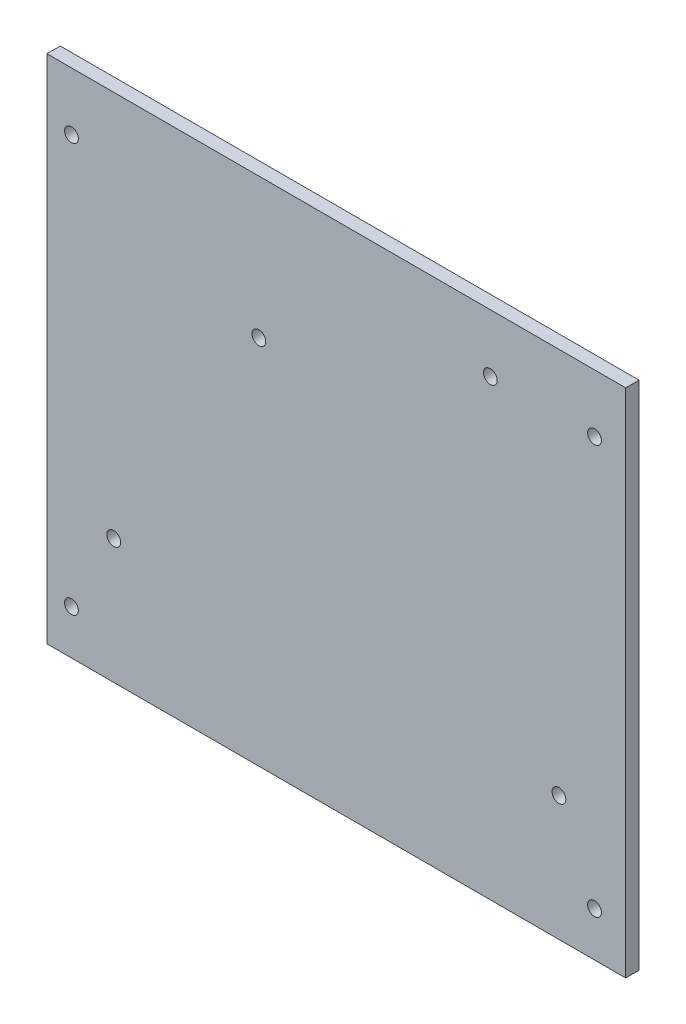
ISO-10303-21;
HEADER;
FILE_DESCRIPTION(('STEP AP214'),'2;1');
FILE_NAME('part.step','',(''),(''),'','','');
FILE_SCHEMA(('AUTOMOTIVE_DESIGN { 1 0 10303 214 1 1 1 1 }'));
ENDSEC;
DATA;
#1=APPLICATION_CONTEXT('core data for automotive mechanical design processes');
#2=APPLICATION_PROTOCOL_DEFINITION('international standard','automotive_design',2000,#1);
#3=PRODUCT_CONTEXT('',#1,'mechanical');
#4=PRODUCT('Part','Part','',(#3));
#5=PRODUCT_RELATED_PRODUCT_CATEGORY('part','',(#4));
#6=PRODUCT_DEFINITION_FORMATION('','',#4);
#7=PRODUCT_DEFINITION_CONTEXT('part definition',#1,'design');
#8=PRODUCT_DEFINITION('design','',#6,#7);
#9=PRODUCT_DEFINITION_SHAPE('','',#8);
#10=(LENGTH_UNIT() NAMED_UNIT(*) SI_UNIT(.MILLI.,.METRE.));
#11=(NAMED_UNIT(*) PLANE_ANGLE_UNIT() SI_UNIT($,.RADIAN.));
#12=(NAMED_UNIT(*) SI_UNIT($,.STERADIAN.) SOLID_ANGLE_UNIT());
#13=UNCERTAINTY_MEASURE_WITH_UNIT(LENGTH_MEASURE(1.E-05),#10,'distance_accuracy_value','');
#14=(GEOMETRIC_REPRESENTATION_CONTEXT(3) GLOBAL_UNCERTAINTY_ASSIGNED_CONTEXT((#13)) GLOBAL_UNIT_ASSIGNED_CONTEXT((#10,
#11,#12)) REPRESENTATION_CONTEXT('',''));
#15=CARTESIAN_POINT('',(0.,0.,0.));
#16=DIRECTION('',(0.,0.,1.));
#17=DIRECTION('',(1.,0.,0.));
#18=AXIS2_PLACEMENT_3D('',#15,#16,#17);
#19=CARTESIAN_POINT('',(0.,0.,3.));
#20=DIRECTION('',(0.,0.,-1.));
#21=DIRECTION('',(-1.,0.,0.));
#22=AXIS2_PLACEMENT_3D('',#19,#20,#21);
#23=PLANE('',#22);
#24=CARTESIAN_POINT('',(34.6,44.4,3.));
#25=DIRECTION('',(0.,0.,-1.));
#26=DIRECTION('',(-1.,0.,0.));
#27=AXIS2_PLACEMENT_3D('',#24,#25,#26);
#28=CIRCLE('',#27,1.55);
#29=CARTESIAN_POINT('',(33.05,44.4,3.));
#30=VERTEX_POINT('',#29);
#31=EDGE_CURVE('E143',#30,#30,#28,.F.);
#32=ORIENTED_EDGE('',*,*,#31,.F.);
#33=EDGE_LOOP('',(#32));
#34=FACE_BOUND('',#33,.T.);
#35=CARTESIAN_POINT('',(-17.4,25.96,3.));
#36=DIRECTION('',(0.,0.,-1.));
#37=DIRECTION('',(-1.,0.,0.));
#38=AXIS2_PLACEMENT_3D('',#35,#36,#37);
#39=CIRCLE('',#38,1.55);
#40=CARTESIAN_POINT('',(-18.95,25.96,3.));
#41=VERTEX_POINT('',#40);
#42=EDGE_CURVE('E148',#41,#41,#39,.F.);
#43=ORIENTED_EDGE('',*,*,#42,.F.);
#44=EDGE_LOOP('',(#43));
#45=FACE_BOUND('',#44,.T.);
#46=CARTESIAN_POINT('',(50.,-29.4,3.));
#47=DIRECTION('',(0.,0.,-1.));
#48=DIRECTION('',(-1.,0.,0.));
#49=AXIS2_PLACEMENT_3D('',#46,#47,#48);
#50=CIRCLE('',#49,1.54999999999999);
#51=CARTESIAN_POINT('',(48.45,-29.4,3.));
#52=VERTEX_POINT('',#51);
#53=EDGE_CURVE('E133',#52,#52,#50,.F.);
#54=ORIENTED_EDGE('',*,*,#53,.F.);
#55=EDGE_LOOP('',(#54));
#56=FACE_BOUND('',#55,.T.);
#57=CARTESIAN_POINT('',(-50.,-29.4,3.));
#58=DIRECTION('',(0.,0.,-1.));
#59=DIRECTION('',(-1.,0.,0.));
#60=AXIS2_PLACEMENT_3D('',#57,#58,#59);
#61=CIRCLE('',#60,1.54999999999999);
#62=CARTESIAN_POINT('',(-51.55,-29.4,3.));
#63=VERTEX_POINT('',#62);
#64=EDGE_CURVE('E136',#63,#63,#61,.F.);
#65=ORIENTED_EDGE('',*,*,#64,.F.);
#66=EDGE_LOOP('',(#65));
#67=FACE_BOUND('',#66,.T.);
#68=DIRECTION('',(0.,1.,0.));
#69=VECTOR('',#68,1.);
#70=CARTESIAN_POINT('',(65.,-57.4,3.));
#71=LINE('',#70,#69);
#72=CARTESIAN_POINT('',(65.,-57.4,3.));
#73=VERTEX_POINT('',#72);
#74=CARTESIAN_POINT('',(65.,57.4,3.));
#75=VERTEX_POINT('',#74);
#76=EDGE_CURVE('E85',#73,#75,#71,.T.);
#77=ORIENTED_EDGE('',*,*,#76,.T.);
#78=DIRECTION('',(-1.,0.,0.));
#79=VECTOR('',#78,1.);
#80=CARTESIAN_POINT('',(-65.,57.4,3.));
#81=LINE('',#80,#79);
#82=CARTESIAN_POINT('',(-65.,57.4,3.));
#83=VERTEX_POINT('',#82);
#84=EDGE_CURVE('E80',#75,#83,#81,.T.);
#85=ORIENTED_EDGE('',*,*,#84,.T.);
#86=DIRECTION('',(0.,-1.,0.));
#87=VECTOR('',#86,1.);
#88=CARTESIAN_POINT('',(-65.,-57.4,3.));
#89=LINE('',#88,#87);
#90=CARTESIAN_POINT('',(-65.,-57.4,3.));
#91=VERTEX_POINT('',#90);
#92=EDGE_CURVE('E83',#83,#91,#89,.T.);
#93=ORIENTED_EDGE('',*,*,#92,.T.);
#94=DIRECTION('',(1.,0.,0.));
#95=VECTOR('',#94,1.);
#96=CARTESIAN_POINT('',(-65.,-57.4,3.));
#97=LINE('',#96,#95);
#98=EDGE_CURVE('E50',#91,#73,#97,.T.);
#99=ORIENTED_EDGE('',*,*,#98,.T.);
#100=EDGE_LOOP('',(#77,#85,#93,#99));
#101=FACE_BOUND('',#100,.T.);
#102=CARTESIAN_POINT('',(-59.5,44.4,3.));
#103=DIRECTION('',(0.,0.,1.));
#104=DIRECTION('',(1.,0.,0.));
#105=AXIS2_PLACEMENT_3D('',#102,#103,#104);
#106=CIRCLE('',#105,1.55);
#107=CARTESIAN_POINT('',(-57.95,44.4,3.));
#108=VERTEX_POINT('',#107);
#109=EDGE_CURVE('E100',#108,#108,#106,.T.);
#110=ORIENTED_EDGE('',*,*,#109,.F.);
#111=EDGE_LOOP('',(#110));
#112=FACE_BOUND('',#111,.T.);
#113=CARTESIAN_POINT('',(58.,44.4,3.));
#114=DIRECTION('',(0.,0.,1.));
#115=DIRECTION('',(1.,0.,0.));
#116=AXIS2_PLACEMENT_3D('',#113,#114,#115);
#117=CIRCLE('',#116,1.55);
#118=CARTESIAN_POINT('',(59.55,44.4,3.));
#119=VERTEX_POINT('',#118);
#120=EDGE_CURVE('E115',#119,#119,#117,.T.);
#121=ORIENTED_EDGE('',*,*,#120,.F.);
#122=EDGE_LOOP('',(#121));
#123=FACE_BOUND('',#122,.T.);
#124=CARTESIAN_POINT('',(58.,-47.4,3.));
#125=DIRECTION('',(0.,0.,1.));
#126=DIRECTION('',(1.,0.,0.));
#127=AXIS2_PLACEMENT_3D('',#124,#125,#126);
#128=CIRCLE('',#127,1.55);
#129=CARTESIAN_POINT('',(59.55,-47.4,3.));
#130=VERTEX_POINT('',#129);
#131=EDGE_CURVE('E121',#130,#130,#128,.T.);
#132=ORIENTED_EDGE('',*,*,#131,.F.);
#133=EDGE_LOOP('',(#132));
#134=FACE_BOUND('',#133,.T.);
#135=CARTESIAN_POINT('',(-59.5,-47.4,3.));
#136=DIRECTION('',(0.,0.,1.));
#137=DIRECTION('',(1.,0.,0.));
#138=AXIS2_PLACEMENT_3D('',#135,#136,#137);
#139=CIRCLE('',#138,1.55);
#140=CARTESIAN_POINT('',(-57.95,-47.4,3.));
#141=VERTEX_POINT('',#140);
#142=EDGE_CURVE('E127',#141,#141,#139,.T.);
#143=ORIENTED_EDGE('',*,*,#142,.F.);
#144=EDGE_LOOP('',(#143));
#145=FACE_BOUND('',#144,.T.);
#146=ADVANCED_FACE('F33',(#34,#45,#56,#67,#101,#112,#123,#134,#145),#23,.F.);
#147=CARTESIAN_POINT('',(0.,0.,0.));
#148=DIRECTION('',(0.,0.,-1.));
#149=DIRECTION('',(-1.,0.,0.));
#150=AXIS2_PLACEMENT_3D('',#147,#148,#149);
#151=PLANE('',#150);
#152=CARTESIAN_POINT('',(34.6,44.4,0.));
#153=DIRECTION('',(0.,0.,-1.));
#154=DIRECTION('',(-1.,0.,0.));
#155=AXIS2_PLACEMENT_3D('',#152,#153,#154);
#156=CIRCLE('',#155,1.55);
#157=CARTESIAN_POINT('',(33.05,44.4,0.));
#158=VERTEX_POINT('',#157);
#159=EDGE_CURVE('E151',#158,#158,#156,.T.);
#160=ORIENTED_EDGE('',*,*,#159,.F.);
#161=EDGE_LOOP('',(#160));
#162=FACE_BOUND('',#161,.T.);
#163=CARTESIAN_POINT('',(-17.4,25.96,0.));
#164=DIRECTION('',(0.,0.,-1.));
#165=DIRECTION('',(-1.,0.,0.));
#166=AXIS2_PLACEMENT_3D('',#163,#164,#165);
#167=CIRCLE('',#166,1.55);
#168=CARTESIAN_POINT('',(-18.95,25.96,0.));
#169=VERTEX_POINT('',#168);
#170=EDGE_CURVE('E152',#169,#169,#167,.T.);
#171=ORIENTED_EDGE('',*,*,#170,.F.);
#172=EDGE_LOOP('',(#171));
#173=FACE_BOUND('',#172,.T.);
#174=CARTESIAN_POINT('',(50.,-29.4,0.));
#175=DIRECTION('',(0.,0.,-1.));
#176=DIRECTION('',(-1.,0.,0.));
#177=AXIS2_PLACEMENT_3D('',#174,#175,#176);
#178=CIRCLE('',#177,1.54999999999999);
#179=CARTESIAN_POINT('',(48.45,-29.4,0.));
#180=VERTEX_POINT('',#179);
#181=EDGE_CURVE('E139',#180,#180,#178,.T.);
#182=ORIENTED_EDGE('',*,*,#181,.F.);
#183=EDGE_LOOP('',(#182));
#184=FACE_BOUND('',#183,.T.);
#185=CARTESIAN_POINT('',(-50.,-29.4,0.));
#186=DIRECTION('',(0.,0.,-1.));
#187=DIRECTION('',(-1.,0.,0.));
#188=AXIS2_PLACEMENT_3D('',#185,#186,#187);
#189=CIRCLE('',#188,1.54999999999999);
#190=CARTESIAN_POINT('',(-51.55,-29.4,0.));
#191=VERTEX_POINT('',#190);
#192=EDGE_CURVE('E140',#191,#191,#189,.T.);
#193=ORIENTED_EDGE('',*,*,#192,.F.);
#194=EDGE_LOOP('',(#193));
#195=FACE_BOUND('',#194,.T.);
#196=CARTESIAN_POINT('',(58.,-47.4,0.));
#197=DIRECTION('',(0.,0.,1.));
#198=DIRECTION('',(1.,0.,0.));
#199=AXIS2_PLACEMENT_3D('',#196,#197,#198);
#200=CIRCLE('',#199,1.55);
#201=CARTESIAN_POINT('',(59.55,-47.4,0.));
#202=VERTEX_POINT('',#201);
#203=EDGE_CURVE('E124',#202,#202,#200,.T.);
#204=ORIENTED_EDGE('',*,*,#203,.T.);
#205=EDGE_LOOP('',(#204));
#206=FACE_BOUND('',#205,.T.);
#207=CARTESIAN_POINT('',(-59.5,44.4,0.));
#208=DIRECTION('',(0.,0.,1.));
#209=DIRECTION('',(1.,0.,0.));
#210=AXIS2_PLACEMENT_3D('',#207,#208,#209);
#211=CIRCLE('',#210,1.55);
#212=CARTESIAN_POINT('',(-57.95,44.4,0.));
#213=VERTEX_POINT('',#212);
#214=EDGE_CURVE('E112',#213,#213,#211,.T.);
#215=ORIENTED_EDGE('',*,*,#214,.T.);
#216=EDGE_LOOP('',(#215));
#217=FACE_BOUND('',#216,.T.);
#218=DIRECTION('',(0.,1.,0.));
#219=VECTOR('',#218,1.);
#220=CARTESIAN_POINT('',(65.,-57.4,0.));
#221=LINE('',#220,#219);
#222=CARTESIAN_POINT('',(65.,-57.4,0.));
#223=VERTEX_POINT('',#222);
#224=CARTESIAN_POINT('',(65.,57.4,0.));
#225=VERTEX_POINT('',#224);
#226=EDGE_CURVE('E97',#223,#225,#221,.T.);
#227=ORIENTED_EDGE('',*,*,#226,.F.);
#228=DIRECTION('',(1.,0.,0.));
#229=VECTOR('',#228,1.);
#230=CARTESIAN_POINT('',(-65.,-57.4,0.));
#231=LINE('',#230,#229);
#232=CARTESIAN_POINT('',(-65.,-57.4,0.));
#233=VERTEX_POINT('',#232);
#234=EDGE_CURVE('E73',#233,#223,#231,.T.);
#235=ORIENTED_EDGE('',*,*,#234,.F.);
#236=DIRECTION('',(0.,-1.,0.));
#237=VECTOR('',#236,1.);
#238=CARTESIAN_POINT('',(-65.,-57.4,0.));
#239=LINE('',#238,#237);
#240=CARTESIAN_POINT('',(-65.,57.4,0.));
#241=VERTEX_POINT('',#240);
#242=EDGE_CURVE('E67',#241,#233,#239,.T.);
#243=ORIENTED_EDGE('',*,*,#242,.F.);
#244=DIRECTION('',(-1.,0.,0.));
#245=VECTOR('',#244,1.);
#246=CARTESIAN_POINT('',(-65.,57.4,0.));
#247=LINE('',#246,#245);
#248=EDGE_CURVE('E89',#225,#241,#247,.T.);
#249=ORIENTED_EDGE('',*,*,#248,.F.);
#250=EDGE_LOOP('',(#227,#235,#243,#249));
#251=FACE_BOUND('',#250,.T.);
#252=CARTESIAN_POINT('',(58.,44.4,0.));
#253=DIRECTION('',(0.,0.,1.));
#254=DIRECTION('',(1.,0.,0.));
#255=AXIS2_PLACEMENT_3D('',#252,#253,#254);
#256=CIRCLE('',#255,1.55);
#257=CARTESIAN_POINT('',(59.55,44.4,0.));
#258=VERTEX_POINT('',#257);
#259=EDGE_CURVE('E118',#258,#258,#256,.T.);
#260=ORIENTED_EDGE('',*,*,#259,.T.);
#261=EDGE_LOOP('',(#260));
#262=FACE_BOUND('',#261,.T.);
#263=CARTESIAN_POINT('',(-59.5,-47.4,0.));
#264=DIRECTION('',(0.,0.,1.));
#265=DIRECTION('',(1.,0.,0.));
#266=AXIS2_PLACEMENT_3D('',#263,#264,#265);
#267=CIRCLE('',#266,1.55);
#268=CARTESIAN_POINT('',(-57.95,-47.4,0.));
#269=VERTEX_POINT('',#268);
#270=EDGE_CURVE('E130',#269,#269,#267,.T.);
#271=ORIENTED_EDGE('',*,*,#270,.T.);
#272=EDGE_LOOP('',(#271));
#273=FACE_BOUND('',#272,.T.);
#274=ADVANCED_FACE('F108',(#162,#173,#184,#195,#206,#217,#251,#262,#273),#151,.T.);
#275=CARTESIAN_POINT('',(65.,-57.4,3.));
#276=DIRECTION('',(-1.,0.,0.));
#277=DIRECTION('',(0.,0.,1.));
#278=AXIS2_PLACEMENT_3D('',#275,#276,#277);
#279=PLANE('',#278);
#280=ORIENTED_EDGE('',*,*,#226,.T.);
#281=DIRECTION('',(0.,0.,-1.));
#282=VECTOR('',#281,1.);
#283=CARTESIAN_POINT('',(65.,57.4,3.));
#284=LINE('',#283,#282);
#285=EDGE_CURVE('E11',#75,#225,#284,.T.);
#286=ORIENTED_EDGE('',*,*,#285,.F.);
#287=ORIENTED_EDGE('',*,*,#76,.F.);
#288=DIRECTION('',(0.,0.,-1.));
#289=VECTOR('',#288,1.);
#290=CARTESIAN_POINT('',(65.,-57.4,3.));
#291=LINE('',#290,#289);
#292=EDGE_CURVE('E93',#73,#223,#291,.T.);
#293=ORIENTED_EDGE('',*,*,#292,.T.);
#294=EDGE_LOOP('',(#280,#286,#287,#293));
#295=FACE_BOUND('',#294,.T.);
#296=ADVANCED_FACE('F35',(#295),#279,.F.);
#297=CARTESIAN_POINT('',(-65.,57.4,3.));
#298=DIRECTION('',(0.,-1.,0.));
#299=DIRECTION('',(0.,0.,-1.));
#300=AXIS2_PLACEMENT_3D('',#297,#298,#299);
#301=PLANE('',#300);
#302=ORIENTED_EDGE('',*,*,#248,.T.);
#303=DIRECTION('',(0.,0.,-1.));
#304=VECTOR('',#303,1.);
#305=CARTESIAN_POINT('',(-65.,57.4,3.));
#306=LINE('',#305,#304);
#307=EDGE_CURVE('E42',#83,#241,#306,.T.);
#308=ORIENTED_EDGE('',*,*,#307,.F.);
#309=ORIENTED_EDGE('',*,*,#84,.F.);
#310=ORIENTED_EDGE('',*,*,#285,.T.);
#311=EDGE_LOOP('',(#302,#308,#309,#310));
#312=FACE_BOUND('',#311,.T.);
#313=ADVANCED_FACE('F88',(#312),#301,.F.);
#314=CARTESIAN_POINT('',(-65.,-57.4,3.));
#315=DIRECTION('',(1.,0.,0.));
#316=DIRECTION('',(0.,0.,-1.));
#317=AXIS2_PLACEMENT_3D('',#314,#315,#316);
#318=PLANE('',#317);
#319=ORIENTED_EDGE('',*,*,#242,.T.);
#320=DIRECTION('',(0.,0.,-1.));
#321=VECTOR('',#320,1.);
#322=CARTESIAN_POINT('',(-65.,-57.4,3.));
#323=LINE('',#322,#321);
#324=EDGE_CURVE('E90',#91,#233,#323,.T.);
#325=ORIENTED_EDGE('',*,*,#324,.F.);
#326=ORIENTED_EDGE('',*,*,#92,.F.);
#327=ORIENTED_EDGE('',*,*,#307,.T.);
#328=EDGE_LOOP('',(#319,#325,#326,#327));
#329=FACE_BOUND('',#328,.T.);
#330=ADVANCED_FACE('F91',(#329),#318,.F.);
#331=CARTESIAN_POINT('',(-65.,-57.4,3.));
#332=DIRECTION('',(0.,1.,0.));
#333=DIRECTION('',(0.,0.,1.));
#334=AXIS2_PLACEMENT_3D('',#331,#332,#333);
#335=PLANE('',#334);
#336=ORIENTED_EDGE('',*,*,#234,.T.);
#337=ORIENTED_EDGE('',*,*,#292,.F.);
#338=ORIENTED_EDGE('',*,*,#98,.F.);
#339=ORIENTED_EDGE('',*,*,#324,.T.);
#340=EDGE_LOOP('',(#336,#337,#338,#339));
#341=FACE_BOUND('',#340,.T.);
#342=ADVANCED_FACE('F105',(#341),#335,.F.);
#343=CARTESIAN_POINT('',(-59.5,44.4,3.));
#344=DIRECTION('',(0.,0.,-1.));
#345=DIRECTION('',(-1.,0.,0.));
#346=AXIS2_PLACEMENT_3D('',#343,#344,#345);
#347=CYLINDRICAL_SURFACE('',#346,1.55);
#348=ORIENTED_EDGE('',*,*,#109,.T.);
#349=EDGE_LOOP('',(#348));
#350=FACE_BOUND('',#349,.T.);
#351=ORIENTED_EDGE('',*,*,#214,.F.);
#352=EDGE_LOOP('',(#351));
#353=FACE_BOUND('',#352,.T.);
#354=ADVANCED_FACE('F176',(#350,#353),#347,.F.);
#355=CARTESIAN_POINT('',(58.,44.4,3.));
#356=DIRECTION('',(0.,0.,-1.));
#357=DIRECTION('',(-1.,0.,0.));
#358=AXIS2_PLACEMENT_3D('',#355,#356,#357);
#359=CYLINDRICAL_SURFACE('',#358,1.55);
#360=ORIENTED_EDGE('',*,*,#120,.T.);
#361=EDGE_LOOP('',(#360));
#362=FACE_BOUND('',#361,.T.);
#363=ORIENTED_EDGE('',*,*,#259,.F.);
#364=EDGE_LOOP('',(#363));
#365=FACE_BOUND('',#364,.T.);
#366=ADVANCED_FACE('F178',(#362,#365),#359,.F.);
#367=CARTESIAN_POINT('',(58.,-47.4,3.));
#368=DIRECTION('',(0.,0.,-1.));
#369=DIRECTION('',(-1.,0.,0.));
#370=AXIS2_PLACEMENT_3D('',#367,#368,#369);
#371=CYLINDRICAL_SURFACE('',#370,1.55);
#372=ORIENTED_EDGE('',*,*,#131,.T.);
#373=EDGE_LOOP('',(#372));
#374=FACE_BOUND('',#373,.T.);
#375=ORIENTED_EDGE('',*,*,#203,.F.);
#376=EDGE_LOOP('',(#375));
#377=FACE_BOUND('',#376,.T.);
#378=ADVANCED_FACE('F185',(#374,#377),#371,.F.);
#379=CARTESIAN_POINT('',(-59.5,-47.4,3.));
#380=DIRECTION('',(0.,0.,-1.));
#381=DIRECTION('',(-1.,0.,0.));
#382=AXIS2_PLACEMENT_3D('',#379,#380,#381);
#383=CYLINDRICAL_SURFACE('',#382,1.55);
#384=ORIENTED_EDGE('',*,*,#142,.T.);
#385=EDGE_LOOP('',(#384));
#386=FACE_BOUND('',#385,.T.);
#387=ORIENTED_EDGE('',*,*,#270,.F.);
#388=EDGE_LOOP('',(#387));
#389=FACE_BOUND('',#388,.T.);
#390=ADVANCED_FACE('F242',(#386,#389),#383,.F.);
#391=CARTESIAN_POINT('',(-50.,-29.4,3.001));
#392=DIRECTION('',(0.,0.,-1.));
#393=DIRECTION('',(-1.,0.,0.));
#394=AXIS2_PLACEMENT_3D('',#391,#392,#393);
#395=CYLINDRICAL_SURFACE('',#394,1.54999999999999);
#396=CARTESIAN_POINT('',(-51.55,-29.4,0.));
#397=CARTESIAN_POINT('',(-51.55,-29.4,0.0312500000000005));
#398=CARTESIAN_POINT('',(-51.55,-29.4,0.0625000000000005));
#399=CARTESIAN_POINT('',(-51.55,-29.4,0.125000000000001));
#400=CARTESIAN_POINT('',(-51.55,-29.4,0.156250000000001));
#401=CARTESIAN_POINT('',(-51.55,-29.4,0.218750000000001));
#402=CARTESIAN_POINT('',(-51.55,-29.4,0.250000000000001));
#403=CARTESIAN_POINT('',(-51.55,-29.4,0.312500000000001));
#404=CARTESIAN_POINT('',(-51.55,-29.4,0.34375));
#405=CARTESIAN_POINT('',(-51.55,-29.4,0.40625));
#406=CARTESIAN_POINT('',(-51.55,-29.4,0.4375));
#407=CARTESIAN_POINT('',(-51.55,-29.4,0.5));
#408=CARTESIAN_POINT('',(-51.55,-29.4,0.53125));
#409=CARTESIAN_POINT('',(-51.55,-29.4,0.593750000000001));
#410=CARTESIAN_POINT('',(-51.55,-29.4,0.625000000000001));
#411=CARTESIAN_POINT('',(-51.55,-29.4,0.687500000000001));
#412=CARTESIAN_POINT('',(-51.55,-29.4,0.71875));
#413=CARTESIAN_POINT('',(-51.55,-29.4,0.78125));
#414=CARTESIAN_POINT('',(-51.55,-29.4,0.8125));
#415=CARTESIAN_POINT('',(-51.55,-29.4,0.875));
#416=CARTESIAN_POINT('',(-51.55,-29.4,0.90625));
#417=CARTESIAN_POINT('',(-51.55,-29.4,0.96875));
#418=CARTESIAN_POINT('',(-51.55,-29.4,1.));
#419=CARTESIAN_POINT('',(-51.55,-29.4,1.0625));
#420=CARTESIAN_POINT('',(-51.55,-29.4,1.09375));
#421=CARTESIAN_POINT('',(-51.55,-29.4,1.15625));
#422=CARTESIAN_POINT('',(-51.55,-29.4,1.1875));
#423=CARTESIAN_POINT('',(-51.55,-29.4,1.25));
#424=CARTESIAN_POINT('',(-51.55,-29.4,1.28125));
#425=CARTESIAN_POINT('',(-51.55,-29.4,1.34375));
#426=CARTESIAN_POINT('',(-51.55,-29.4,1.375));
#427=CARTESIAN_POINT('',(-51.55,-29.4,1.4375));
#428=CARTESIAN_POINT('',(-51.55,-29.4,1.46875));
#429=CARTESIAN_POINT('',(-51.55,-29.4,1.53125));
#430=CARTESIAN_POINT('',(-51.55,-29.4,1.5625));
#431=CARTESIAN_POINT('',(-51.55,-29.4,1.625));
#432=CARTESIAN_POINT('',(-51.55,-29.4,1.65625));
#433=CARTESIAN_POINT('',(-51.55,-29.4,1.71875));
#434=CARTESIAN_POINT('',(-51.55,-29.4,1.75));
#435=CARTESIAN_POINT('',(-51.55,-29.4,1.8125));
#436=CARTESIAN_POINT('',(-51.55,-29.4,1.84375));
#437=CARTESIAN_POINT('',(-51.55,-29.4,1.90625));
#438=CARTESIAN_POINT('',(-51.55,-29.4,1.9375));
#439=CARTESIAN_POINT('',(-51.55,-29.4,2.));
#440=CARTESIAN_POINT('',(-51.55,-29.4,2.03125));
#441=CARTESIAN_POINT('',(-51.55,-29.4,2.09375));
#442=CARTESIAN_POINT('',(-51.55,-29.4,2.125));
#443=CARTESIAN_POINT('',(-51.55,-29.4,2.1875));
#444=CARTESIAN_POINT('',(-51.55,-29.4,2.21875));
#445=CARTESIAN_POINT('',(-51.55,-29.4,2.28125));
#446=CARTESIAN_POINT('',(-51.55,-29.4,2.3125));
#447=CARTESIAN_POINT('',(-51.55,-29.4,2.375));
#448=CARTESIAN_POINT('',(-51.55,-29.4,2.40625));
#449=CARTESIAN_POINT('',(-51.55,-29.4,2.46875));
#450=CARTESIAN_POINT('',(-51.55,-29.4,2.5));
#451=CARTESIAN_POINT('',(-51.55,-29.4,2.5625));
#452=CARTESIAN_POINT('',(-51.55,-29.4,2.59375));
#453=CARTESIAN_POINT('',(-51.55,-29.4,2.65625));
#454=CARTESIAN_POINT('',(-51.55,-29.4,2.6875));
#455=CARTESIAN_POINT('',(-51.55,-29.4,2.75));
#456=CARTESIAN_POINT('',(-51.55,-29.4,2.78125));
#457=CARTESIAN_POINT('',(-51.55,-29.4,2.84375));
#458=CARTESIAN_POINT('',(-51.55,-29.4,2.875));
#459=CARTESIAN_POINT('',(-51.55,-29.4,2.9375));
#460=CARTESIAN_POINT('',(-51.55,-29.4,2.96875));
#461=CARTESIAN_POINT('',(-51.55,-29.4,3.));
#462=B_SPLINE_CURVE_WITH_KNOTS('',3,(#396,#397,#398,#399,#400,#401,#402,#403,#404,#405,#406,
#407,#408,#409,#410,#411,#412,#413,#414,#415,#416,#417,#418,#419,#420,#421,#422,#423,#424,#425,
#426,#427,#428,#429,#430,#431,#432,#433,#434,#435,#436,#437,#438,#439,#440,#441,#442,#443,#444,
#445,#446,#447,#448,#449,#450,#451,#452,#453,#454,#455,#456,#457,#458,#459,#460,#461),
.UNSPECIFIED.,.F.,.F.,(4,2,2,2,2,2,2,2,2,2,2,2,2,2,2,2,2,2,2,2,2,2,2,2,2,2,2,2,2,2,2,2,4),(0.,
0.0937500000000001,0.1875,0.28125,0.375,0.46875,0.5625,0.65625,0.75,0.84375,0.9375,1.03125,
1.125,1.21875,1.3125,1.40625,1.5,1.59375,1.6875,1.78125,1.875,1.96875,2.0625,2.15625,2.25,
2.34375,2.4375,2.53125,2.625,2.71875,2.8125,2.90625,3.),.UNSPECIFIED.);
#463=EDGE_CURVE('BSEAM238',#191,#63,#462,.T.);
#464=ORIENTED_EDGE('',*,*,#192,.T.);
#465=ORIENTED_EDGE('',*,*,#64,.T.);
#466=ORIENTED_EDGE('',*,*,#463,.T.);
#467=ORIENTED_EDGE('',*,*,#463,.F.);
#468=EDGE_LOOP('',(#464,#466,#465,#467));
#469=FACE_BOUND('',#468,.T.);
#470=ADVANCED_FACE('F238',(#469),#395,.F.);
#471=CARTESIAN_POINT('',(50.,-29.4,3.001));
#472=DIRECTION('',(0.,0.,-1.));
#473=DIRECTION('',(-1.,0.,0.));
#474=AXIS2_PLACEMENT_3D('',#471,#472,#473);
#475=CYLINDRICAL_SURFACE('',#474,1.54999999999999);
#476=CARTESIAN_POINT('',(48.45,-29.4,0.));
#477=CARTESIAN_POINT('',(48.45,-29.4,0.0312500000000005));
#478=CARTESIAN_POINT('',(48.45,-29.4,0.0625000000000005));
#479=CARTESIAN_POINT('',(48.45,-29.4,0.125000000000001));
#480=CARTESIAN_POINT('',(48.45,-29.4,0.156250000000001));
#481=CARTESIAN_POINT('',(48.45,-29.4,0.218750000000001));
#482=CARTESIAN_POINT('',(48.45,-29.4,0.250000000000001));
#483=CARTESIAN_POINT('',(48.45,-29.4,0.312500000000001));
#484=CARTESIAN_POINT('',(48.45,-29.4,0.34375));
#485=CARTESIAN_POINT('',(48.45,-29.4,0.40625));
#486=CARTESIAN_POINT('',(48.45,-29.4,0.4375));
#487=CARTESIAN_POINT('',(48.45,-29.4,0.5));
#488=CARTESIAN_POINT('',(48.45,-29.4,0.53125));
#489=CARTESIAN_POINT('',(48.45,-29.4,0.593750000000001));
#490=CARTESIAN_POINT('',(48.45,-29.4,0.625000000000001));
#491=CARTESIAN_POINT('',(48.45,-29.4,0.687500000000001));
#492=CARTESIAN_POINT('',(48.45,-29.4,0.71875));
#493=CARTESIAN_POINT('',(48.45,-29.4,0.78125));
#494=CARTESIAN_POINT('',(48.45,-29.4,0.8125));
#495=CARTESIAN_POINT('',(48.45,-29.4,0.875));
#496=CARTESIAN_POINT('',(48.45,-29.4,0.90625));
#497=CARTESIAN_POINT('',(48.45,-29.4,0.96875));
#498=CARTESIAN_POINT('',(48.45,-29.4,1.));
#499=CARTESIAN_POINT('',(48.45,-29.4,1.0625));
#500=CARTESIAN_POINT('',(48.45,-29.4,1.09375));
#501=CARTESIAN_POINT('',(48.45,-29.4,1.15625));
#502=CARTESIAN_POINT('',(48.45,-29.4,1.1875));
#503=CARTESIAN_POINT('',(48.45,-29.4,1.25));
#504=CARTESIAN_POINT('',(48.45,-29.4,1.28125));
#505=CARTESIAN_POINT('',(48.45,-29.4,1.34375));
#506=CARTESIAN_POINT('',(48.45,-29.4,1.375));
#507=CARTESIAN_POINT('',(48.45,-29.4,1.4375));
#508=CARTESIAN_POINT('',(48.45,-29.4,1.46875));
#509=CARTESIAN_POINT('',(48.45,-29.4,1.53125));
#510=CARTESIAN_POINT('',(48.45,-29.4,1.5625));
#511=CARTESIAN_POINT('',(48.45,-29.4,1.625));
#512=CARTESIAN_POINT('',(48.45,-29.4,1.65625));
#513=CARTESIAN_POINT('',(48.45,-29.4,1.71875));
#514=CARTESIAN_POINT('',(48.45,-29.4,1.75));
#515=CARTESIAN_POINT('',(48.45,-29.4,1.8125));
#516=CARTESIAN_POINT('',(48.45,-29.4,1.84375));
#517=CARTESIAN_POINT('',(48.45,-29.4,1.90625));
#518=CARTESIAN_POINT('',(48.45,-29.4,1.9375));
#519=CARTESIAN_POINT('',(48.45,-29.4,2.));
#520=CARTESIAN_POINT('',(48.45,-29.4,2.03125));
#521=CARTESIAN_POINT('',(48.45,-29.4,2.09375));
#522=CARTESIAN_POINT('',(48.45,-29.4,2.125));
#523=CARTESIAN_POINT('',(48.45,-29.4,2.1875));
#524=CARTESIAN_POINT('',(48.45,-29.4,2.21875));
#525=CARTESIAN_POINT('',(48.45,-29.4,2.28125));
#526=CARTESIAN_POINT('',(48.45,-29.4,2.3125));
#527=CARTESIAN_POINT('',(48.45,-29.4,2.375));
#528=CARTESIAN_POINT('',(48.45,-29.4,2.40625));
#529=CARTESIAN_POINT('',(48.45,-29.4,2.46875));
#530=CARTESIAN_POINT('',(48.45,-29.4,2.5));
#531=CARTESIAN_POINT('',(48.45,-29.4,2.5625));
#532=CARTESIAN_POINT('',(48.45,-29.4,2.59375));
#533=CARTESIAN_POINT('',(48.45,-29.4,2.65625));
#534=CARTESIAN_POINT('',(48.45,-29.4,2.6875));
#535=CARTESIAN_POINT('',(48.45,-29.4,2.75));
#536=CARTESIAN_POINT('',(48.45,-29.4,2.78125));
#537=CARTESIAN_POINT('',(48.45,-29.4,2.84375));
#538=CARTESIAN_POINT('',(48.45,-29.4,2.875));
#539=CARTESIAN_POINT('',(48.45,-29.4,2.9375));
#540=CARTESIAN_POINT('',(48.45,-29.4,2.96875));
#541=CARTESIAN_POINT('',(48.45,-29.4,3.));
#542=B_SPLINE_CURVE_WITH_KNOTS('',3,(#476,#477,#478,#479,#480,#481,#482,#483,#484,#485,#486,
#487,#488,#489,#490,#491,#492,#493,#494,#495,#496,#497,#498,#499,#500,#501,#502,#503,#504,#505,
#506,#507,#508,#509,#510,#511,#512,#513,#514,#515,#516,#517,#518,#519,#520,#521,#522,#523,#524,
#525,#526,#527,#528,#529,#530,#531,#532,#533,#534,#535,#536,#537,#538,#539,#540,#541),
.UNSPECIFIED.,.F.,.F.,(4,2,2,2,2,2,2,2,2,2,2,2,2,2,2,2,2,2,2,2,2,2,2,2,2,2,2,2,2,2,2,2,4),(0.,
0.0937500000000001,0.1875,0.28125,0.375,0.46875,0.5625,0.65625,0.75,0.84375,0.9375,1.03125,
1.125,1.21875,1.3125,1.40625,1.5,1.59375,1.6875,1.78125,1.875,1.96875,2.0625,2.15625,2.25,
2.34375,2.4375,2.53125,2.625,2.71875,2.8125,2.90625,3.),.UNSPECIFIED.);
#543=EDGE_CURVE('BSEAM221',#180,#52,#542,.T.);
#544=ORIENTED_EDGE('',*,*,#181,.T.);
#545=ORIENTED_EDGE('',*,*,#53,.T.);
#546=ORIENTED_EDGE('',*,*,#543,.T.);
#547=ORIENTED_EDGE('',*,*,#543,.F.);
#548=EDGE_LOOP('',(#544,#546,#545,#547));
#549=FACE_BOUND('',#548,.T.);
#550=ADVANCED_FACE('F221',(#549),#475,.F.);
#551=CARTESIAN_POINT('',(-17.4,25.96,3.001));
#552=DIRECTION('',(0.,0.,-1.));
#553=DIRECTION('',(-1.,0.,0.));
#554=AXIS2_PLACEMENT_3D('',#551,#552,#553);
#555=CYLINDRICAL_SURFACE('',#554,1.55);
#556=CARTESIAN_POINT('',(-18.95,25.96,0.));
#557=CARTESIAN_POINT('',(-18.95,25.96,0.0312500000000005));
#558=CARTESIAN_POINT('',(-18.95,25.96,0.0625000000000005));
#559=CARTESIAN_POINT('',(-18.95,25.96,0.125000000000001));
#560=CARTESIAN_POINT('',(-18.95,25.96,0.156250000000001));
#561=CARTESIAN_POINT('',(-18.95,25.96,0.218750000000001));
#562=CARTESIAN_POINT('',(-18.95,25.96,0.250000000000001));
#563=CARTESIAN_POINT('',(-18.95,25.96,0.312500000000001));
#564=CARTESIAN_POINT('',(-18.95,25.96,0.34375));
#565=CARTESIAN_POINT('',(-18.95,25.96,0.40625));
#566=CARTESIAN_POINT('',(-18.95,25.96,0.4375));
#567=CARTESIAN_POINT('',(-18.95,25.96,0.5));
#568=CARTESIAN_POINT('',(-18.95,25.96,0.53125));
#569=CARTESIAN_POINT('',(-18.95,25.96,0.593750000000001));
#570=CARTESIAN_POINT('',(-18.95,25.96,0.625000000000001));
#571=CARTESIAN_POINT('',(-18.95,25.96,0.687500000000001));
#572=CARTESIAN_POINT('',(-18.95,25.96,0.71875));
#573=CARTESIAN_POINT('',(-18.95,25.96,0.78125));
#574=CARTESIAN_POINT('',(-18.95,25.96,0.8125));
#575=CARTESIAN_POINT('',(-18.95,25.96,0.875));
#576=CARTESIAN_POINT('',(-18.95,25.96,0.90625));
#577=CARTESIAN_POINT('',(-18.95,25.96,0.96875));
#578=CARTESIAN_POINT('',(-18.95,25.96,1.));
#579=CARTESIAN_POINT('',(-18.95,25.96,1.0625));
#580=CARTESIAN_POINT('',(-18.95,25.96,1.09375));
#581=CARTESIAN_POINT('',(-18.95,25.96,1.15625));
#582=CARTESIAN_POINT('',(-18.95,25.96,1.1875));
#583=CARTESIAN_POINT('',(-18.95,25.96,1.25));
#584=CARTESIAN_POINT('',(-18.95,25.96,1.28125));
#585=CARTESIAN_POINT('',(-18.95,25.96,1.34375));
#586=CARTESIAN_POINT('',(-18.95,25.96,1.375));
#587=CARTESIAN_POINT('',(-18.95,25.96,1.4375));
#588=CARTESIAN_POINT('',(-18.95,25.96,1.46875));
#589=CARTESIAN_POINT('',(-18.95,25.96,1.53125));
#590=CARTESIAN_POINT('',(-18.95,25.96,1.5625));
#591=CARTESIAN_POINT('',(-18.95,25.96,1.625));
#592=CARTESIAN_POINT('',(-18.95,25.96,1.65625));
#593=CARTESIAN_POINT('',(-18.95,25.96,1.71875));
#594=CARTESIAN_POINT('',(-18.95,25.96,1.75));
#595=CARTESIAN_POINT('',(-18.95,25.96,1.8125));
#596=CARTESIAN_POINT('',(-18.95,25.96,1.84375));
#597=CARTESIAN_POINT('',(-18.95,25.96,1.90625));
#598=CARTESIAN_POINT('',(-18.95,25.96,1.9375));
#599=CARTESIAN_POINT('',(-18.95,25.96,2.));
#600=CARTESIAN_POINT('',(-18.95,25.96,2.03125));
#601=CARTESIAN_POINT('',(-18.95,25.96,2.09375));
#602=CARTESIAN_POINT('',(-18.95,25.96,2.125));
#603=CARTESIAN_POINT('',(-18.95,25.96,2.1875));
#604=CARTESIAN_POINT('',(-18.95,25.96,2.21875));
#605=CARTESIAN_POINT('',(-18.95,25.96,2.28125));
#606=CARTESIAN_POINT('',(-18.95,25.96,2.3125));
#607=CARTESIAN_POINT('',(-18.95,25.96,2.375));
#608=CARTESIAN_POINT('',(-18.95,25.96,2.40625));
#609=CARTESIAN_POINT('',(-18.95,25.96,2.46875));
#610=CARTESIAN_POINT('',(-18.95,25.96,2.5));
#611=CARTESIAN_POINT('',(-18.95,25.96,2.5625));
#612=CARTESIAN_POINT('',(-18.95,25.96,2.59375));
#613=CARTESIAN_POINT('',(-18.95,25.96,2.65625));
#614=CARTESIAN_POINT('',(-18.95,25.96,2.6875));
#615=CARTESIAN_POINT('',(-18.95,25.96,2.75));
#616=CARTESIAN_POINT('',(-18.95,25.96,2.78125));
#617=CARTESIAN_POINT('',(-18.95,25.96,2.84375));
#618=CARTESIAN_POINT('',(-18.95,25.96,2.875));
#619=CARTESIAN_POINT('',(-18.95,25.96,2.9375));
#620=CARTESIAN_POINT('',(-18.95,25.96,2.96875));
#621=CARTESIAN_POINT('',(-18.95,25.96,3.));
#622=B_SPLINE_CURVE_WITH_KNOTS('',3,(#556,#557,#558,#559,#560,#561,#562,#563,#564,#565,#566,
#567,#568,#569,#570,#571,#572,#573,#574,#575,#576,#577,#578,#579,#580,#581,#582,#583,#584,#585,
#586,#587,#588,#589,#590,#591,#592,#593,#594,#595,#596,#597,#598,#599,#600,#601,#602,#603,#604,
#605,#606,#607,#608,#609,#610,#611,#612,#613,#614,#615,#616,#617,#618,#619,#620,#621),
.UNSPECIFIED.,.F.,.F.,(4,2,2,2,2,2,2,2,2,2,2,2,2,2,2,2,2,2,2,2,2,2,2,2,2,2,2,2,2,2,2,2,4),(0.,
0.0937500000000001,0.1875,0.28125,0.375,0.46875,0.5625,0.65625,0.75,0.84375,0.9375,1.03125,
1.125,1.21875,1.3125,1.40625,1.5,1.59375,1.6875,1.78125,1.875,1.96875,2.0625,2.15625,2.25,
2.34375,2.4375,2.53125,2.625,2.71875,2.8125,2.90625,3.),.UNSPECIFIED.);
#623=EDGE_CURVE('BSEAM216',#169,#41,#622,.T.);
#624=ORIENTED_EDGE('',*,*,#170,.T.);
#625=ORIENTED_EDGE('',*,*,#42,.T.);
#626=ORIENTED_EDGE('',*,*,#623,.T.);
#627=ORIENTED_EDGE('',*,*,#623,.F.);
#628=EDGE_LOOP('',(#624,#626,#625,#627));
#629=FACE_BOUND('',#628,.T.);
#630=ADVANCED_FACE('F216',(#629),#555,.F.);
#631=CARTESIAN_POINT('',(34.6,44.4,3.001));
#632=DIRECTION('',(0.,0.,-1.));
#633=DIRECTION('',(-1.,0.,0.));
#634=AXIS2_PLACEMENT_3D('',#631,#632,#633);
#635=CYLINDRICAL_SURFACE('',#634,1.55);
#636=CARTESIAN_POINT('',(33.05,44.4,0.));
#637=CARTESIAN_POINT('',(33.05,44.4,0.0312500000000005));
#638=CARTESIAN_POINT('',(33.05,44.4,0.0625000000000005));
#639=CARTESIAN_POINT('',(33.05,44.4,0.125000000000001));
#640=CARTESIAN_POINT('',(33.05,44.4,0.156250000000001));
#641=CARTESIAN_POINT('',(33.05,44.4,0.218750000000001));
#642=CARTESIAN_POINT('',(33.05,44.4,0.250000000000001));
#643=CARTESIAN_POINT('',(33.05,44.4,0.312500000000001));
#644=CARTESIAN_POINT('',(33.05,44.4,0.34375));
#645=CARTESIAN_POINT('',(33.05,44.4,0.40625));
#646=CARTESIAN_POINT('',(33.05,44.4,0.4375));
#647=CARTESIAN_POINT('',(33.05,44.4,0.5));
#648=CARTESIAN_POINT('',(33.05,44.4,0.53125));
#649=CARTESIAN_POINT('',(33.05,44.4,0.593750000000001));
#650=CARTESIAN_POINT('',(33.05,44.4,0.625000000000001));
#651=CARTESIAN_POINT('',(33.05,44.4,0.687500000000001));
#652=CARTESIAN_POINT('',(33.05,44.4,0.71875));
#653=CARTESIAN_POINT('',(33.05,44.4,0.78125));
#654=CARTESIAN_POINT('',(33.05,44.4,0.8125));
#655=CARTESIAN_POINT('',(33.05,44.4,0.875));
#656=CARTESIAN_POINT('',(33.05,44.4,0.90625));
#657=CARTESIAN_POINT('',(33.05,44.4,0.96875));
#658=CARTESIAN_POINT('',(33.05,44.4,1.));
#659=CARTESIAN_POINT('',(33.05,44.4,1.0625));
#660=CARTESIAN_POINT('',(33.05,44.4,1.09375));
#661=CARTESIAN_POINT('',(33.05,44.4,1.15625));
#662=CARTESIAN_POINT('',(33.05,44.4,1.1875));
#663=CARTESIAN_POINT('',(33.05,44.4,1.25));
#664=CARTESIAN_POINT('',(33.05,44.4,1.28125));
#665=CARTESIAN_POINT('',(33.05,44.4,1.34375));
#666=CARTESIAN_POINT('',(33.05,44.4,1.375));
#667=CARTESIAN_POINT('',(33.05,44.4,1.4375));
#668=CARTESIAN_POINT('',(33.05,44.4,1.46875));
#669=CARTESIAN_POINT('',(33.05,44.4,1.53125));
#670=CARTESIAN_POINT('',(33.05,44.4,1.5625));
#671=CARTESIAN_POINT('',(33.05,44.4,1.625));
#672=CARTESIAN_POINT('',(33.05,44.4,1.65625));
#673=CARTESIAN_POINT('',(33.05,44.4,1.71875));
#674=CARTESIAN_POINT('',(33.05,44.4,1.75));
#675=CARTESIAN_POINT('',(33.05,44.4,1.8125));
#676=CARTESIAN_POINT('',(33.05,44.4,1.84375));
#677=CARTESIAN_POINT('',(33.05,44.4,1.90625));
#678=CARTESIAN_POINT('',(33.05,44.4,1.9375));
#679=CARTESIAN_POINT('',(33.05,44.4,2.));
#680=CARTESIAN_POINT('',(33.05,44.4,2.03125));
#681=CARTESIAN_POINT('',(33.05,44.4,2.09375));
#682=CARTESIAN_POINT('',(33.05,44.4,2.125));
#683=CARTESIAN_POINT('',(33.05,44.4,2.1875));
#684=CARTESIAN_POINT('',(33.05,44.4,2.21875));
#685=CARTESIAN_POINT('',(33.05,44.4,2.28125));
#686=CARTESIAN_POINT('',(33.05,44.4,2.3125));
#687=CARTESIAN_POINT('',(33.05,44.4,2.375));
#688=CARTESIAN_POINT('',(33.05,44.4,2.40625));
#689=CARTESIAN_POINT('',(33.05,44.4,2.46875));
#690=CARTESIAN_POINT('',(33.05,44.4,2.5));
#691=CARTESIAN_POINT('',(33.05,44.4,2.5625));
#692=CARTESIAN_POINT('',(33.05,44.4,2.59375));
#693=CARTESIAN_POINT('',(33.05,44.4,2.65625));
#694=CARTESIAN_POINT('',(33.05,44.4,2.6875));
#695=CARTESIAN_POINT('',(33.05,44.4,2.75));
#696=CARTESIAN_POINT('',(33.05,44.4,2.78125));
#697=CARTESIAN_POINT('',(33.05,44.4,2.84375));
#698=CARTESIAN_POINT('',(33.05,44.4,2.875));
#699=CARTESIAN_POINT('',(33.05,44.4,2.9375));
#700=CARTESIAN_POINT('',(33.05,44.4,2.96875));
#701=CARTESIAN_POINT('',(33.05,44.4,3.));
#702=B_SPLINE_CURVE_WITH_KNOTS('',3,(#636,#637,#638,#639,#640,#641,#642,#643,#644,#645,#646,
#647,#648,#649,#650,#651,#652,#653,#654,#655,#656,#657,#658,#659,#660,#661,#662,#663,#664,#665,
#666,#667,#668,#669,#670,#671,#672,#673,#674,#675,#676,#677,#678,#679,#680,#681,#682,#683,#684,
#685,#686,#687,#688,#689,#690,#691,#692,#693,#694,#695,#696,#697,#698,#699,#700,#701),
.UNSPECIFIED.,.F.,.F.,(4,2,2,2,2,2,2,2,2,2,2,2,2,2,2,2,2,2,2,2,2,2,2,2,2,2,2,2,2,2,2,2,4),(0.,
0.0937500000000001,0.1875,0.28125,0.375,0.46875,0.5625,0.65625,0.75,0.84375,0.9375,1.03125,
1.125,1.21875,1.3125,1.40625,1.5,1.59375,1.6875,1.78125,1.875,1.96875,2.0625,2.15625,2.25,
2.34375,2.4375,2.53125,2.625,2.71875,2.8125,2.90625,3.),.UNSPECIFIED.);
#703=EDGE_CURVE('BSEAM160',#158,#30,#702,.T.);
#704=ORIENTED_EDGE('',*,*,#159,.T.);
#705=ORIENTED_EDGE('',*,*,#31,.T.);
#706=ORIENTED_EDGE('',*,*,#703,.T.);
#707=ORIENTED_EDGE('',*,*,#703,.F.);
#708=EDGE_LOOP('',(#704,#706,#705,#707));
#709=FACE_BOUND('',#708,.T.);
#710=ADVANCED_FACE('F160',(#709),#635,.F.);
#711=CLOSED_SHELL('',(#146,#274,#296,#313,#330,#342,#354,#366,#378,#390,#470,#550,#630,#710));
#712=MANIFOLD_SOLID_BREP('B2',#711);
#713=ADVANCED_BREP_SHAPE_REPRESENTATION('',(#18,#712),#14);
#714=SHAPE_DEFINITION_REPRESENTATION(#9,#713);
ENDSEC;
END-ISO-10303-21;
